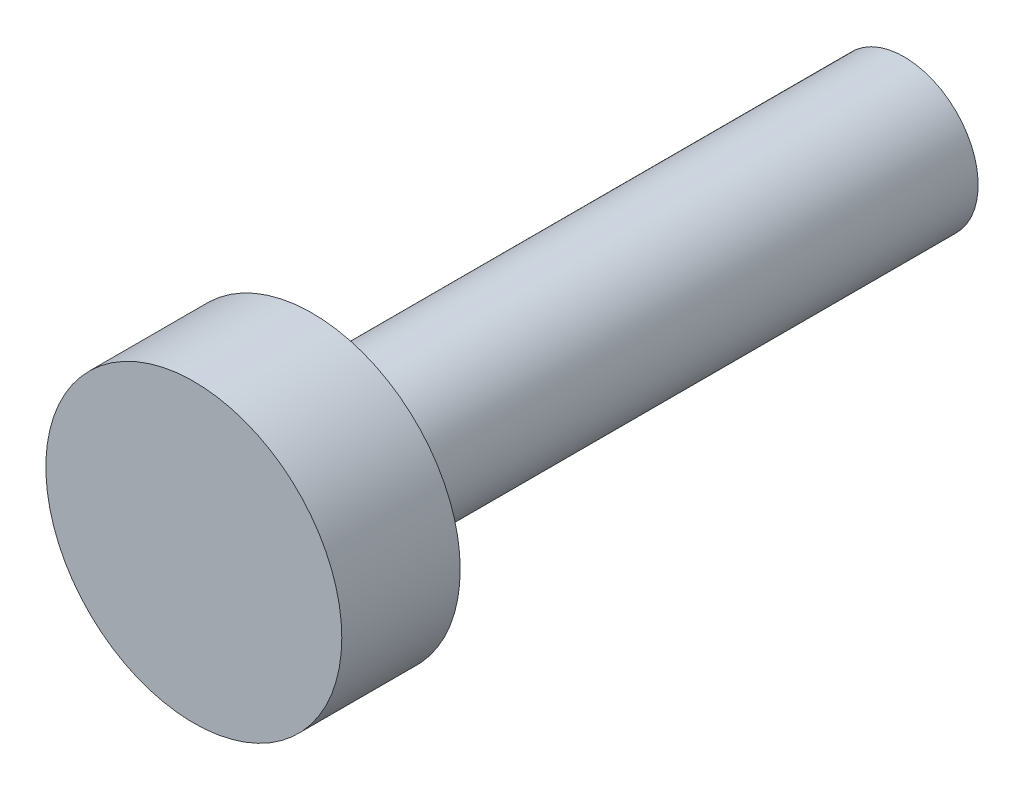
ISO-10303-21;
HEADER;
FILE_DESCRIPTION(('STEP AP214'),'2;1');
FILE_NAME('part.step','',(''),(''),'','','');
FILE_SCHEMA(('AUTOMOTIVE_DESIGN { 1 0 10303 214 1 1 1 1 }'));
ENDSEC;
DATA;
#1=APPLICATION_CONTEXT('core data for automotive mechanical design processes');
#2=APPLICATION_PROTOCOL_DEFINITION('international standard','automotive_design',2000,#1);
#3=PRODUCT_CONTEXT('',#1,'mechanical');
#4=PRODUCT('Part','Part','',(#3));
#5=PRODUCT_RELATED_PRODUCT_CATEGORY('part','',(#4));
#6=PRODUCT_DEFINITION_FORMATION('','',#4);
#7=PRODUCT_DEFINITION_CONTEXT('part definition',#1,'design');
#8=PRODUCT_DEFINITION('design','',#6,#7);
#9=PRODUCT_DEFINITION_SHAPE('','',#8);
#10=(LENGTH_UNIT() NAMED_UNIT(*) SI_UNIT(.MILLI.,.METRE.));
#11=(NAMED_UNIT(*) PLANE_ANGLE_UNIT() SI_UNIT($,.RADIAN.));
#12=(NAMED_UNIT(*) SI_UNIT($,.STERADIAN.) SOLID_ANGLE_UNIT());
#13=UNCERTAINTY_MEASURE_WITH_UNIT(LENGTH_MEASURE(1.E-05),#10,'distance_accuracy_value','');
#14=(GEOMETRIC_REPRESENTATION_CONTEXT(3) GLOBAL_UNCERTAINTY_ASSIGNED_CONTEXT((#13)) GLOBAL_UNIT_ASSIGNED_CONTEXT((#10,
#11,#12)) REPRESENTATION_CONTEXT('',''));
#15=CARTESIAN_POINT('',(0.,0.,0.));
#16=DIRECTION('',(0.,0.,1.));
#17=DIRECTION('',(1.,0.,0.));
#18=AXIS2_PLACEMENT_3D('',#15,#16,#17);
#19=CARTESIAN_POINT('',(0.,0.,1.6));
#20=DIRECTION('',(0.,0.,-1.));
#21=DIRECTION('',(-1.,0.,0.));
#22=AXIS2_PLACEMENT_3D('',#19,#20,#21);
#23=CYLINDRICAL_SURFACE('',#22,2.);
#24=CARTESIAN_POINT('',(0.,0.,1.6));
#25=DIRECTION('',(0.,0.,1.));
#26=DIRECTION('',(1.,0.,0.));
#27=AXIS2_PLACEMENT_3D('',#24,#25,#26);
#28=CIRCLE('',#27,2.);
#29=CARTESIAN_POINT('',(2.,0.,1.6));
#30=VERTEX_POINT('',#29);
#31=EDGE_CURVE('E38',#30,#30,#28,.T.);
#32=ORIENTED_EDGE('',*,*,#31,.F.);
#33=EDGE_LOOP('',(#32));
#34=FACE_BOUND('',#33,.T.);
#35=CARTESIAN_POINT('',(0.,0.,0.));
#36=DIRECTION('',(0.,0.,1.));
#37=DIRECTION('',(1.,0.,0.));
#38=AXIS2_PLACEMENT_3D('',#35,#36,#37);
#39=CIRCLE('',#38,2.);
#40=CARTESIAN_POINT('',(2.,0.,0.));
#41=VERTEX_POINT('',#40);
#42=EDGE_CURVE('E34',#41,#41,#39,.T.);
#43=ORIENTED_EDGE('',*,*,#42,.T.);
#44=EDGE_LOOP('',(#43));
#45=FACE_BOUND('',#44,.T.);
#46=ADVANCED_FACE('F31',(#34,#45),#23,.T.);
#47=CARTESIAN_POINT('',(0.,0.,1.6));
#48=DIRECTION('',(0.,0.,1.));
#49=DIRECTION('',(1.,0.,0.));
#50=AXIS2_PLACEMENT_3D('',#47,#48,#49);
#51=PLANE('',#50);
#52=ORIENTED_EDGE('',*,*,#31,.T.);
#53=EDGE_LOOP('',(#52));
#54=FACE_BOUND('',#53,.T.);
#55=ADVANCED_FACE('F55',(#54),#51,.T.);
#56=CARTESIAN_POINT('',(0.,0.,0.));
#57=DIRECTION('',(0.,0.,1.));
#58=DIRECTION('',(1.,0.,0.));
#59=AXIS2_PLACEMENT_3D('',#56,#57,#58);
#60=PLANE('',#59);
#61=CARTESIAN_POINT('',(0.,0.,0.));
#62=DIRECTION('',(0.,0.,-1.));
#63=DIRECTION('',(-1.,0.,0.));
#64=AXIS2_PLACEMENT_3D('',#61,#62,#63);
#65=CIRCLE('',#64,1.);
#66=CARTESIAN_POINT('',(-1.,0.,0.));
#67=VERTEX_POINT('',#66);
#68=EDGE_CURVE('E10',#67,#67,#65,.T.);
#69=ORIENTED_EDGE('',*,*,#68,.F.);
#70=EDGE_LOOP('',(#69));
#71=FACE_BOUND('',#70,.T.);
#72=ORIENTED_EDGE('',*,*,#42,.F.);
#73=EDGE_LOOP('',(#72));
#74=FACE_BOUND('',#73,.T.);
#75=ADVANCED_FACE('F52',(#71,#74),#60,.F.);
#76=CARTESIAN_POINT('',(0.,0.,-8.));
#77=DIRECTION('',(0.,0.,1.));
#78=DIRECTION('',(1.,0.,0.));
#79=AXIS2_PLACEMENT_3D('',#76,#77,#78);
#80=CYLINDRICAL_SURFACE('',#79,1.);
#81=CARTESIAN_POINT('',(0.,0.,-8.));
#82=DIRECTION('',(0.,0.,-1.));
#83=DIRECTION('',(-1.,0.,0.));
#84=AXIS2_PLACEMENT_3D('',#81,#82,#83);
#85=CIRCLE('',#84,1.);
#86=CARTESIAN_POINT('',(-1.,0.,-8.));
#87=VERTEX_POINT('',#86);
#88=EDGE_CURVE('E44',#87,#87,#85,.T.);
#89=ORIENTED_EDGE('',*,*,#88,.F.);
#90=EDGE_LOOP('',(#89));
#91=FACE_BOUND('',#90,.T.);
#92=ORIENTED_EDGE('',*,*,#68,.T.);
#93=EDGE_LOOP('',(#92));
#94=FACE_BOUND('',#93,.T.);
#95=ADVANCED_FACE('F54',(#91,#94),#80,.T.);
#96=CARTESIAN_POINT('',(0.,0.,-8.));
#97=DIRECTION('',(0.,0.,-1.));
#98=DIRECTION('',(-1.,0.,0.));
#99=AXIS2_PLACEMENT_3D('',#96,#97,#98);
#100=PLANE('',#99);
#101=ORIENTED_EDGE('',*,*,#88,.T.);
#102=EDGE_LOOP('',(#101));
#103=FACE_BOUND('',#102,.T.);
#104=ADVANCED_FACE('F61',(#103),#100,.T.);
#105=CLOSED_SHELL('',(#46,#55,#75,#95,#104));
#106=MANIFOLD_SOLID_BREP('B2',#105);
#107=ADVANCED_BREP_SHAPE_REPRESENTATION('',(#18,#106),#14);
#108=SHAPE_DEFINITION_REPRESENTATION(#9,#107);
ENDSEC;
END-ISO-10303-21;
